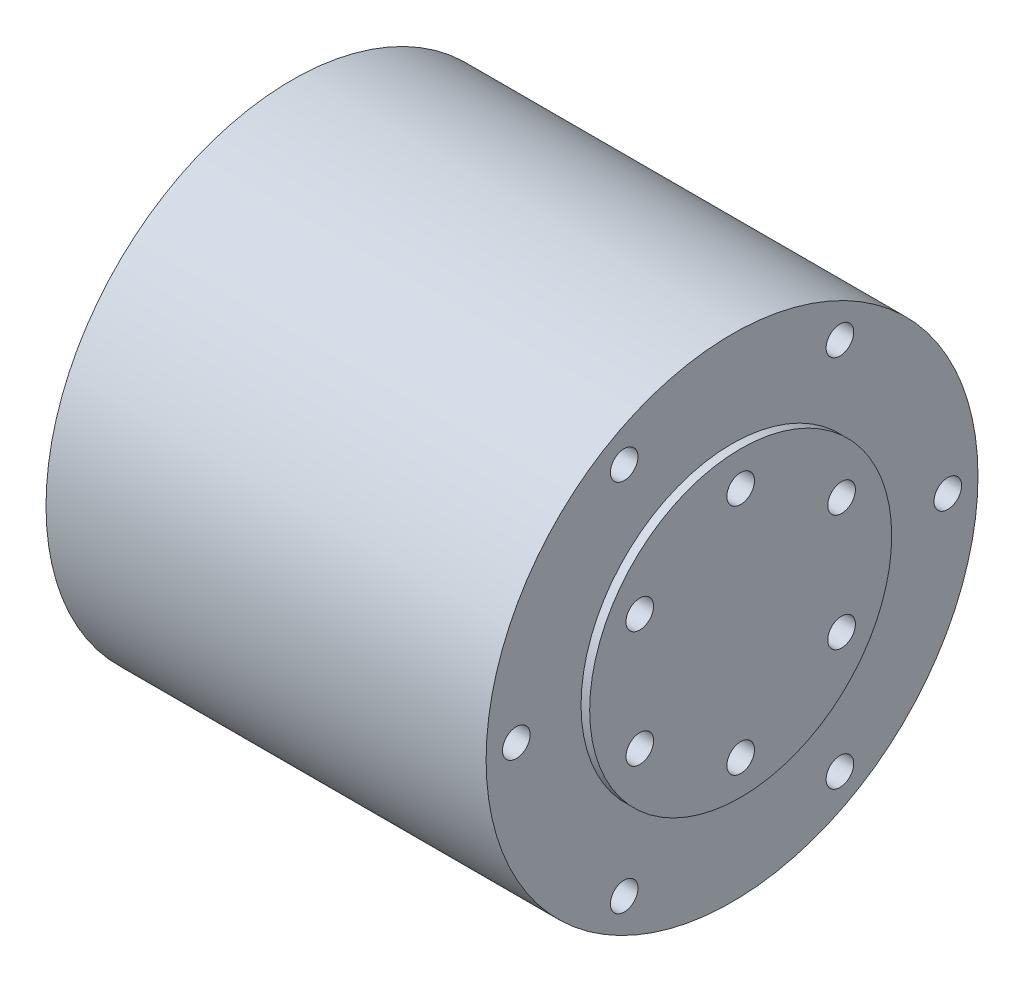
ISO-10303-21;
HEADER;
FILE_DESCRIPTION(('STEP AP214'),'2;1');
FILE_NAME('part.step','',(''),(''),'','','');
FILE_SCHEMA(('AUTOMOTIVE_DESIGN { 1 0 10303 214 1 1 1 1 }'));
ENDSEC;
DATA;
#1=APPLICATION_CONTEXT('core data for automotive mechanical design processes');
#2=APPLICATION_PROTOCOL_DEFINITION('international standard','automotive_design',2000,#1);
#3=PRODUCT_CONTEXT('',#1,'mechanical');
#4=PRODUCT('Part','Part','',(#3));
#5=PRODUCT_RELATED_PRODUCT_CATEGORY('part','',(#4));
#6=PRODUCT_DEFINITION_FORMATION('','',#4);
#7=PRODUCT_DEFINITION_CONTEXT('part definition',#1,'design');
#8=PRODUCT_DEFINITION('design','',#6,#7);
#9=PRODUCT_DEFINITION_SHAPE('','',#8);
#10=(LENGTH_UNIT() NAMED_UNIT(*) SI_UNIT(.MILLI.,.METRE.));
#11=(NAMED_UNIT(*) PLANE_ANGLE_UNIT() SI_UNIT($,.RADIAN.));
#12=(NAMED_UNIT(*) SI_UNIT($,.STERADIAN.) SOLID_ANGLE_UNIT());
#13=UNCERTAINTY_MEASURE_WITH_UNIT(LENGTH_MEASURE(1.E-05),#10,'distance_accuracy_value','');
#14=(GEOMETRIC_REPRESENTATION_CONTEXT(3) GLOBAL_UNCERTAINTY_ASSIGNED_CONTEXT((#13)) GLOBAL_UNIT_ASSIGNED_CONTEXT((#10,
#11,#12)) REPRESENTATION_CONTEXT('',''));
#15=CARTESIAN_POINT('',(0.,0.,0.));
#16=DIRECTION('',(0.,0.,1.));
#17=DIRECTION('',(1.,0.,0.));
#18=AXIS2_PLACEMENT_3D('',#15,#16,#17);
#19=CARTESIAN_POINT('',(51.,0.,0.));
#20=DIRECTION('',(-1.,0.,0.));
#21=DIRECTION('',(0.,0.,1.));
#22=AXIS2_PLACEMENT_3D('',#19,#20,#21);
#23=CYLINDRICAL_SURFACE('',#22,28.5);
#24=CARTESIAN_POINT('',(51.,0.,0.));
#25=DIRECTION('',(1.,0.,0.));
#26=DIRECTION('',(0.,0.,-1.));
#27=AXIS2_PLACEMENT_3D('',#24,#25,#26);
#28=CIRCLE('',#27,28.5);
#29=CARTESIAN_POINT('',(51.,0.,-28.5));
#30=VERTEX_POINT('',#29);
#31=EDGE_CURVE('E51',#30,#30,#28,.T.);
#32=ORIENTED_EDGE('',*,*,#31,.F.);
#33=EDGE_LOOP('',(#32));
#34=FACE_BOUND('',#33,.T.);
#35=CARTESIAN_POINT('',(0.,0.,0.));
#36=DIRECTION('',(1.,0.,0.));
#37=DIRECTION('',(0.,0.,-1.));
#38=AXIS2_PLACEMENT_3D('',#35,#36,#37);
#39=CIRCLE('',#38,28.5);
#40=CARTESIAN_POINT('',(0.,0.,-28.5));
#41=VERTEX_POINT('',#40);
#42=EDGE_CURVE('E46',#41,#41,#39,.T.);
#43=ORIENTED_EDGE('',*,*,#42,.T.);
#44=EDGE_LOOP('',(#43));
#45=FACE_BOUND('',#44,.T.);
#46=ADVANCED_FACE('F43',(#34,#45),#23,.T.);
#47=CARTESIAN_POINT('',(51.,0.,0.));
#48=DIRECTION('',(1.,0.,0.));
#49=DIRECTION('',(0.,0.,-1.));
#50=AXIS2_PLACEMENT_3D('',#47,#48,#49);
#51=PLANE('',#50);
#52=CARTESIAN_POINT('',(51.,21.6506350946109,-12.5000000000002));
#53=DIRECTION('',(1.,0.,0.));
#54=DIRECTION('',(0.,0.,-1.));
#55=AXIS2_PLACEMENT_3D('',#52,#53,#54);
#56=CIRCLE('',#55,1.6);
#57=CARTESIAN_POINT('',(51.,21.6506350946109,-14.1000000000002));
#58=VERTEX_POINT('',#57);
#59=EDGE_CURVE('E107',#58,#58,#56,.T.);
#60=ORIENTED_EDGE('',*,*,#59,.F.);
#61=EDGE_LOOP('',(#60));
#62=FACE_BOUND('',#61,.T.);
#63=CARTESIAN_POINT('',(51.,-2.68882138776405E-13,-25.));
#64=DIRECTION('',(1.,0.,0.));
#65=DIRECTION('',(0.,0.,-1.));
#66=AXIS2_PLACEMENT_3D('',#63,#64,#65);
#67=CIRCLE('',#66,1.6);
#68=CARTESIAN_POINT('',(51.,-2.68882138776405E-13,-26.6));
#69=VERTEX_POINT('',#68);
#70=EDGE_CURVE('E116',#69,#69,#67,.T.);
#71=ORIENTED_EDGE('',*,*,#70,.F.);
#72=EDGE_LOOP('',(#71));
#73=FACE_BOUND('',#72,.T.);
#74=CARTESIAN_POINT('',(51.,-21.6506350946111,-12.4999999999997));
#75=DIRECTION('',(1.,0.,0.));
#76=DIRECTION('',(0.,0.,-1.));
#77=AXIS2_PLACEMENT_3D('',#74,#75,#76);
#78=CIRCLE('',#77,1.6);
#79=CARTESIAN_POINT('',(51.,-21.6506350946111,-14.0999999999997));
#80=VERTEX_POINT('',#79);
#81=EDGE_CURVE('E124',#80,#80,#78,.T.);
#82=ORIENTED_EDGE('',*,*,#81,.F.);
#83=EDGE_LOOP('',(#82));
#84=FACE_BOUND('',#83,.T.);
#85=CARTESIAN_POINT('',(51.,-21.6506350946108,12.5000000000003));
#86=DIRECTION('',(1.,0.,0.));
#87=DIRECTION('',(0.,0.,-1.));
#88=AXIS2_PLACEMENT_3D('',#85,#86,#87);
#89=CIRCLE('',#88,1.6);
#90=CARTESIAN_POINT('',(51.,-21.6506350946108,10.9000000000003));
#91=VERTEX_POINT('',#90);
#92=EDGE_CURVE('E132',#91,#91,#89,.T.);
#93=ORIENTED_EDGE('',*,*,#92,.F.);
#94=EDGE_LOOP('',(#93));
#95=FACE_BOUND('',#94,.T.);
#96=CARTESIAN_POINT('',(51.,4.42354486374086E-13,25.));
#97=DIRECTION('',(1.,0.,0.));
#98=DIRECTION('',(0.,0.,-1.));
#99=AXIS2_PLACEMENT_3D('',#96,#97,#98);
#100=CIRCLE('',#99,1.6);
#101=CARTESIAN_POINT('',(51.,4.42354486374086E-13,23.4));
#102=VERTEX_POINT('',#101);
#103=EDGE_CURVE('E99',#102,#102,#100,.T.);
#104=ORIENTED_EDGE('',*,*,#103,.F.);
#105=EDGE_LOOP('',(#104));
#106=FACE_BOUND('',#105,.T.);
#107=CARTESIAN_POINT('',(51.,21.650635094611,12.4999999999999));
#108=DIRECTION('',(1.,0.,0.));
#109=DIRECTION('',(0.,0.,-1.));
#110=AXIS2_PLACEMENT_3D('',#107,#108,#109);
#111=CIRCLE('',#110,1.6);
#112=CARTESIAN_POINT('',(51.,21.650635094611,10.8999999999999));
#113=VERTEX_POINT('',#112);
#114=EDGE_CURVE('E95',#113,#113,#111,.T.);
#115=ORIENTED_EDGE('',*,*,#114,.F.);
#116=EDGE_LOOP('',(#115));
#117=FACE_BOUND('',#116,.T.);
#118=CARTESIAN_POINT('',(51.,0.,0.));
#119=DIRECTION('',(1.,0.,0.));
#120=DIRECTION('',(0.,0.,-1.));
#121=AXIS2_PLACEMENT_3D('',#118,#119,#120);
#122=CIRCLE('',#121,17.5);
#123=CARTESIAN_POINT('',(51.,0.,-17.5));
#124=VERTEX_POINT('',#123);
#125=EDGE_CURVE('E10',#124,#124,#122,.T.);
#126=ORIENTED_EDGE('',*,*,#125,.F.);
#127=EDGE_LOOP('',(#126));
#128=FACE_BOUND('',#127,.T.);
#129=ORIENTED_EDGE('',*,*,#31,.T.);
#130=EDGE_LOOP('',(#129));
#131=FACE_BOUND('',#130,.T.);
#132=ADVANCED_FACE('F211',(#62,#73,#84,#95,#106,#117,#128,#131),#51,.T.);
#133=CARTESIAN_POINT('',(0.,0.,0.));
#134=DIRECTION('',(1.,0.,0.));
#135=DIRECTION('',(0.,0.,-1.));
#136=AXIS2_PLACEMENT_3D('',#133,#134,#135);
#137=PLANE('',#136);
#138=CARTESIAN_POINT('',(0.,13.4350288425444,13.4350288425444));
#139=DIRECTION('',(-1.,0.,0.));
#140=DIRECTION('',(0.,0.,1.));
#141=AXIS2_PLACEMENT_3D('',#138,#139,#140);
#142=CIRCLE('',#141,1.6);
#143=CARTESIAN_POINT('',(0.,13.4350288425444,15.0350288425444));
#144=VERTEX_POINT('',#143);
#145=EDGE_CURVE('E75',#144,#144,#142,.T.);
#146=ORIENTED_EDGE('',*,*,#145,.F.);
#147=EDGE_LOOP('',(#146));
#148=FACE_BOUND('',#147,.T.);
#149=CARTESIAN_POINT('',(0.,-13.4350288425444,13.4350288425444));
#150=DIRECTION('',(-1.,0.,0.));
#151=DIRECTION('',(0.,0.,1.));
#152=AXIS2_PLACEMENT_3D('',#149,#150,#151);
#153=CIRCLE('',#152,1.6);
#154=CARTESIAN_POINT('',(0.,-13.4350288425444,15.0350288425444));
#155=VERTEX_POINT('',#154);
#156=EDGE_CURVE('E84',#155,#155,#153,.T.);
#157=ORIENTED_EDGE('',*,*,#156,.F.);
#158=EDGE_LOOP('',(#157));
#159=FACE_BOUND('',#158,.T.);
#160=CARTESIAN_POINT('',(0.,-13.4350288425443,-13.4350288425445));
#161=DIRECTION('',(-1.,0.,0.));
#162=DIRECTION('',(0.,0.,1.));
#163=AXIS2_PLACEMENT_3D('',#160,#161,#162);
#164=CIRCLE('',#163,1.6);
#165=CARTESIAN_POINT('',(0.,-13.4350288425443,-11.8350288425445));
#166=VERTEX_POINT('',#165);
#167=EDGE_CURVE('E67',#166,#166,#164,.T.);
#168=ORIENTED_EDGE('',*,*,#167,.F.);
#169=EDGE_LOOP('',(#168));
#170=FACE_BOUND('',#169,.T.);
#171=CARTESIAN_POINT('',(0.,13.4350288425445,-13.4350288425443));
#172=DIRECTION('',(-1.,0.,0.));
#173=DIRECTION('',(0.,0.,1.));
#174=AXIS2_PLACEMENT_3D('',#171,#172,#173);
#175=CIRCLE('',#174,1.6);
#176=CARTESIAN_POINT('',(0.,13.4350288425445,-11.8350288425443));
#177=VERTEX_POINT('',#176);
#178=EDGE_CURVE('E63',#177,#177,#175,.T.);
#179=ORIENTED_EDGE('',*,*,#178,.F.);
#180=EDGE_LOOP('',(#179));
#181=FACE_BOUND('',#180,.T.);
#182=ORIENTED_EDGE('',*,*,#42,.F.);
#183=EDGE_LOOP('',(#182));
#184=FACE_BOUND('',#183,.T.);
#185=ADVANCED_FACE('F205',(#148,#159,#170,#181,#184),#137,.F.);
#186=CARTESIAN_POINT('',(52.,0.,0.));
#187=DIRECTION('',(-1.,0.,0.));
#188=DIRECTION('',(0.,0.,1.));
#189=AXIS2_PLACEMENT_3D('',#186,#187,#188);
#190=CYLINDRICAL_SURFACE('',#189,17.5);
#191=CARTESIAN_POINT('',(52.,0.,0.));
#192=DIRECTION('',(1.,0.,0.));
#193=DIRECTION('',(0.,0.,-1.));
#194=AXIS2_PLACEMENT_3D('',#191,#192,#193);
#195=CIRCLE('',#194,17.5);
#196=CARTESIAN_POINT('',(52.,0.,-17.5));
#197=VERTEX_POINT('',#196);
#198=EDGE_CURVE('E58',#197,#197,#195,.T.);
#199=ORIENTED_EDGE('',*,*,#198,.F.);
#200=EDGE_LOOP('',(#199));
#201=FACE_BOUND('',#200,.T.);
#202=ORIENTED_EDGE('',*,*,#125,.T.);
#203=EDGE_LOOP('',(#202));
#204=FACE_BOUND('',#203,.T.);
#205=ADVANCED_FACE('F197',(#201,#204),#190,.T.);
#206=CARTESIAN_POINT('',(52.,0.,0.));
#207=DIRECTION('',(1.,0.,0.));
#208=DIRECTION('',(0.,0.,-1.));
#209=AXIS2_PLACEMENT_3D('',#206,#207,#208);
#210=PLANE('',#209);
#211=CARTESIAN_POINT('',(52.,13.5,0.));
#212=DIRECTION('',(1.,0.,0.));
#213=DIRECTION('',(0.,0.,-1.));
#214=AXIS2_PLACEMENT_3D('',#211,#212,#213);
#215=CIRCLE('',#214,1.6);
#216=CARTESIAN_POINT('',(52.,13.5,-1.6));
#217=VERTEX_POINT('',#216);
#218=EDGE_CURVE('E155',#217,#217,#215,.T.);
#219=ORIENTED_EDGE('',*,*,#218,.F.);
#220=EDGE_LOOP('',(#219));
#221=FACE_BOUND('',#220,.T.);
#222=CARTESIAN_POINT('',(52.,6.74999999999997,-11.6913429510899));
#223=DIRECTION('',(1.,0.,0.));
#224=DIRECTION('',(0.,0.,-1.));
#225=AXIS2_PLACEMENT_3D('',#222,#223,#224);
#226=CIRCLE('',#225,1.6);
#227=CARTESIAN_POINT('',(52.,6.74999999999997,-13.2913429510899));
#228=VERTEX_POINT('',#227);
#229=EDGE_CURVE('E163',#228,#228,#226,.T.);
#230=ORIENTED_EDGE('',*,*,#229,.F.);
#231=EDGE_LOOP('',(#230));
#232=FACE_BOUND('',#231,.T.);
#233=CARTESIAN_POINT('',(52.,-6.75000000000005,-11.6913429510899));
#234=DIRECTION('',(1.,0.,0.));
#235=DIRECTION('',(0.,0.,-1.));
#236=AXIS2_PLACEMENT_3D('',#233,#234,#235);
#237=CIRCLE('',#236,1.6);
#238=CARTESIAN_POINT('',(52.,-6.75000000000005,-13.2913429510899));
#239=VERTEX_POINT('',#238);
#240=EDGE_CURVE('E171',#239,#239,#237,.T.);
#241=ORIENTED_EDGE('',*,*,#240,.F.);
#242=EDGE_LOOP('',(#241));
#243=FACE_BOUND('',#242,.T.);
#244=CARTESIAN_POINT('',(52.,-13.5,0.));
#245=DIRECTION('',(1.,0.,0.));
#246=DIRECTION('',(0.,0.,-1.));
#247=AXIS2_PLACEMENT_3D('',#244,#245,#246);
#248=CIRCLE('',#247,1.6);
#249=CARTESIAN_POINT('',(52.,-13.5,-1.59999999999991));
#250=VERTEX_POINT('',#249);
#251=EDGE_CURVE('E179',#250,#250,#248,.T.);
#252=ORIENTED_EDGE('',*,*,#251,.F.);
#253=EDGE_LOOP('',(#252));
#254=FACE_BOUND('',#253,.T.);
#255=CARTESIAN_POINT('',(52.,-6.74999999999989,11.69134295109));
#256=DIRECTION('',(1.,0.,0.));
#257=DIRECTION('',(0.,0.,-1.));
#258=AXIS2_PLACEMENT_3D('',#255,#256,#257);
#259=CIRCLE('',#258,1.6);
#260=CARTESIAN_POINT('',(52.,-6.74999999999989,10.09134295109));
#261=VERTEX_POINT('',#260);
#262=EDGE_CURVE('E147',#261,#261,#259,.T.);
#263=ORIENTED_EDGE('',*,*,#262,.F.);
#264=EDGE_LOOP('',(#263));
#265=FACE_BOUND('',#264,.T.);
#266=CARTESIAN_POINT('',(52.,6.75000000000014,11.6913429510898));
#267=DIRECTION('',(1.,0.,0.));
#268=DIRECTION('',(0.,0.,-1.));
#269=AXIS2_PLACEMENT_3D('',#266,#267,#268);
#270=CIRCLE('',#269,1.6);
#271=CARTESIAN_POINT('',(52.,6.75000000000014,10.0913429510898));
#272=VERTEX_POINT('',#271);
#273=EDGE_CURVE('E143',#272,#272,#270,.T.);
#274=ORIENTED_EDGE('',*,*,#273,.F.);
#275=EDGE_LOOP('',(#274));
#276=FACE_BOUND('',#275,.T.);
#277=ORIENTED_EDGE('',*,*,#198,.T.);
#278=EDGE_LOOP('',(#277));
#279=FACE_BOUND('',#278,.T.);
#280=ADVANCED_FACE('F193',(#221,#232,#243,#254,#265,#276,#279),#210,.T.);
#281=CARTESIAN_POINT('',(5.,13.4350288425445,-13.4350288425443));
#282=DIRECTION('',(-1.,0.,0.));
#283=DIRECTION('',(0.,0.,1.));
#284=AXIS2_PLACEMENT_3D('',#281,#282,#283);
#285=CYLINDRICAL_SURFACE('',#284,1.6);
#286=CARTESIAN_POINT('',(5.,13.4350288425445,-13.4350288425443));
#287=DIRECTION('',(-1.,0.,0.));
#288=DIRECTION('',(0.,0.,1.));
#289=AXIS2_PLACEMENT_3D('',#286,#287,#288);
#290=CIRCLE('',#289,1.6);
#291=CARTESIAN_POINT('',(5.,13.4350288425445,-11.8350288425443));
#292=VERTEX_POINT('',#291);
#293=EDGE_CURVE('E62',#292,#292,#290,.T.);
#294=ORIENTED_EDGE('',*,*,#293,.F.);
#295=EDGE_LOOP('',(#294));
#296=FACE_BOUND('',#295,.T.);
#297=ORIENTED_EDGE('',*,*,#178,.T.);
#298=EDGE_LOOP('',(#297));
#299=FACE_BOUND('',#298,.T.);
#300=ADVANCED_FACE('F196',(#296,#299),#285,.F.);
#301=CARTESIAN_POINT('',(5.,13.4350288425445,-13.4350288425443));
#302=DIRECTION('',(-1.,0.,0.));
#303=DIRECTION('',(0.,0.,1.));
#304=AXIS2_PLACEMENT_3D('',#301,#302,#303);
#305=PLANE('',#304);
#306=ORIENTED_EDGE('',*,*,#293,.T.);
#307=EDGE_LOOP('',(#306));
#308=FACE_BOUND('',#307,.T.);
#309=ADVANCED_FACE('F264',(#308),#305,.T.);
#310=CARTESIAN_POINT('',(5.,-13.4350288425443,-13.4350288425445));
#311=DIRECTION('',(-1.,0.,0.));
#312=DIRECTION('',(0.,0.,1.));
#313=AXIS2_PLACEMENT_3D('',#310,#311,#312);
#314=CYLINDRICAL_SURFACE('',#313,1.6);
#315=CARTESIAN_POINT('',(5.,-13.4350288425443,-13.4350288425445));
#316=DIRECTION('',(-1.,0.,0.));
#317=DIRECTION('',(0.,0.,1.));
#318=AXIS2_PLACEMENT_3D('',#315,#316,#317);
#319=CIRCLE('',#318,1.6);
#320=CARTESIAN_POINT('',(5.,-13.4350288425443,-11.8350288425445));
#321=VERTEX_POINT('',#320);
#322=EDGE_CURVE('E88',#321,#321,#319,.T.);
#323=ORIENTED_EDGE('',*,*,#322,.F.);
#324=EDGE_LOOP('',(#323));
#325=FACE_BOUND('',#324,.T.);
#326=ORIENTED_EDGE('',*,*,#167,.T.);
#327=EDGE_LOOP('',(#326));
#328=FACE_BOUND('',#327,.T.);
#329=ADVANCED_FACE('F260',(#325,#328),#314,.F.);
#330=CARTESIAN_POINT('',(5.,-13.4350288425443,-13.4350288425445));
#331=DIRECTION('',(-1.,0.,0.));
#332=DIRECTION('',(0.,0.,1.));
#333=AXIS2_PLACEMENT_3D('',#330,#331,#332);
#334=PLANE('',#333);
#335=ORIENTED_EDGE('',*,*,#322,.T.);
#336=EDGE_LOOP('',(#335));
#337=FACE_BOUND('',#336,.T.);
#338=ADVANCED_FACE('F263',(#337),#334,.T.);
#339=CARTESIAN_POINT('',(5.,-13.4350288425444,13.4350288425444));
#340=DIRECTION('',(-1.,0.,0.));
#341=DIRECTION('',(0.,0.,1.));
#342=AXIS2_PLACEMENT_3D('',#339,#340,#341);
#343=CYLINDRICAL_SURFACE('',#342,1.6);
#344=CARTESIAN_POINT('',(5.,-13.4350288425444,13.4350288425444));
#345=DIRECTION('',(-1.,0.,0.));
#346=DIRECTION('',(0.,0.,1.));
#347=AXIS2_PLACEMENT_3D('',#344,#345,#346);
#348=CIRCLE('',#347,1.6);
#349=CARTESIAN_POINT('',(5.,-13.4350288425444,15.0350288425444));
#350=VERTEX_POINT('',#349);
#351=EDGE_CURVE('E80',#350,#350,#348,.T.);
#352=ORIENTED_EDGE('',*,*,#351,.F.);
#353=EDGE_LOOP('',(#352));
#354=FACE_BOUND('',#353,.T.);
#355=ORIENTED_EDGE('',*,*,#156,.T.);
#356=EDGE_LOOP('',(#355));
#357=FACE_BOUND('',#356,.T.);
#358=ADVANCED_FACE('F268',(#354,#357),#343,.F.);
#359=CARTESIAN_POINT('',(5.,-13.4350288425444,13.4350288425444));
#360=DIRECTION('',(-1.,0.,0.));
#361=DIRECTION('',(0.,0.,1.));
#362=AXIS2_PLACEMENT_3D('',#359,#360,#361);
#363=PLANE('',#362);
#364=ORIENTED_EDGE('',*,*,#351,.T.);
#365=EDGE_LOOP('',(#364));
#366=FACE_BOUND('',#365,.T.);
#367=ADVANCED_FACE('F272',(#366),#363,.T.);
#368=CARTESIAN_POINT('',(5.,13.4350288425444,13.4350288425444));
#369=DIRECTION('',(-1.,0.,0.));
#370=DIRECTION('',(0.,0.,1.));
#371=AXIS2_PLACEMENT_3D('',#368,#369,#370);
#372=CYLINDRICAL_SURFACE('',#371,1.6);
#373=CARTESIAN_POINT('',(5.,13.4350288425444,13.4350288425444));
#374=DIRECTION('',(-1.,0.,0.));
#375=DIRECTION('',(0.,0.,1.));
#376=AXIS2_PLACEMENT_3D('',#373,#374,#375);
#377=CIRCLE('',#376,1.6);
#378=CARTESIAN_POINT('',(5.,13.4350288425444,15.0350288425444));
#379=VERTEX_POINT('',#378);
#380=EDGE_CURVE('E71',#379,#379,#377,.T.);
#381=ORIENTED_EDGE('',*,*,#380,.F.);
#382=EDGE_LOOP('',(#381));
#383=FACE_BOUND('',#382,.T.);
#384=ORIENTED_EDGE('',*,*,#145,.T.);
#385=EDGE_LOOP('',(#384));
#386=FACE_BOUND('',#385,.T.);
#387=ADVANCED_FACE('F254',(#383,#386),#372,.F.);
#388=CARTESIAN_POINT('',(5.,13.4350288425444,13.4350288425444));
#389=DIRECTION('',(-1.,0.,0.));
#390=DIRECTION('',(0.,0.,1.));
#391=AXIS2_PLACEMENT_3D('',#388,#389,#390);
#392=PLANE('',#391);
#393=ORIENTED_EDGE('',*,*,#380,.T.);
#394=EDGE_LOOP('',(#393));
#395=FACE_BOUND('',#394,.T.);
#396=ADVANCED_FACE('F245',(#395),#392,.T.);
#397=CARTESIAN_POINT('',(46.,21.650635094611,12.4999999999999));
#398=DIRECTION('',(1.,0.,0.));
#399=DIRECTION('',(0.,0.,-1.));
#400=AXIS2_PLACEMENT_3D('',#397,#398,#399);
#401=CYLINDRICAL_SURFACE('',#400,1.6);
#402=CARTESIAN_POINT('',(46.,21.650635094611,12.4999999999999));
#403=DIRECTION('',(1.,0.,0.));
#404=DIRECTION('',(0.,0.,-1.));
#405=AXIS2_PLACEMENT_3D('',#402,#403,#404);
#406=CIRCLE('',#405,1.6);
#407=CARTESIAN_POINT('',(46.,21.650635094611,10.8999999999999));
#408=VERTEX_POINT('',#407);
#409=EDGE_CURVE('E76',#408,#408,#406,.T.);
#410=ORIENTED_EDGE('',*,*,#409,.F.);
#411=EDGE_LOOP('',(#410));
#412=FACE_BOUND('',#411,.T.);
#413=ORIENTED_EDGE('',*,*,#114,.T.);
#414=EDGE_LOOP('',(#413));
#415=FACE_BOUND('',#414,.T.);
#416=ADVANCED_FACE('F243',(#412,#415),#401,.F.);
#417=CARTESIAN_POINT('',(46.,21.650635094611,12.4999999999999));
#418=DIRECTION('',(1.,0.,0.));
#419=DIRECTION('',(0.,0.,-1.));
#420=AXIS2_PLACEMENT_3D('',#417,#418,#419);
#421=PLANE('',#420);
#422=ORIENTED_EDGE('',*,*,#409,.T.);
#423=EDGE_LOOP('',(#422));
#424=FACE_BOUND('',#423,.T.);
#425=ADVANCED_FACE('F244',(#424),#421,.T.);
#426=CARTESIAN_POINT('',(46.,4.42354486374086E-13,25.));
#427=DIRECTION('',(1.,0.,0.));
#428=DIRECTION('',(0.,0.,-1.));
#429=AXIS2_PLACEMENT_3D('',#426,#427,#428);
#430=CYLINDRICAL_SURFACE('',#429,1.6);
#431=CARTESIAN_POINT('',(46.,4.42354486374086E-13,25.));
#432=DIRECTION('',(1.,0.,0.));
#433=DIRECTION('',(0.,0.,-1.));
#434=AXIS2_PLACEMENT_3D('',#431,#432,#433);
#435=CIRCLE('',#434,1.6);
#436=CARTESIAN_POINT('',(46.,4.42354486374086E-13,23.4));
#437=VERTEX_POINT('',#436);
#438=EDGE_CURVE('E136',#437,#437,#435,.T.);
#439=ORIENTED_EDGE('',*,*,#438,.F.);
#440=EDGE_LOOP('',(#439));
#441=FACE_BOUND('',#440,.T.);
#442=ORIENTED_EDGE('',*,*,#103,.T.);
#443=EDGE_LOOP('',(#442));
#444=FACE_BOUND('',#443,.T.);
#445=ADVANCED_FACE('F251',(#441,#444),#430,.F.);
#446=CARTESIAN_POINT('',(46.,4.42354486374086E-13,25.));
#447=DIRECTION('',(1.,0.,0.));
#448=DIRECTION('',(0.,0.,-1.));
#449=AXIS2_PLACEMENT_3D('',#446,#447,#448);
#450=PLANE('',#449);
#451=ORIENTED_EDGE('',*,*,#438,.T.);
#452=EDGE_LOOP('',(#451));
#453=FACE_BOUND('',#452,.T.);
#454=ADVANCED_FACE('F349',(#453),#450,.T.);
#455=CARTESIAN_POINT('',(46.,-21.6506350946108,12.5000000000003));
#456=DIRECTION('',(1.,0.,0.));
#457=DIRECTION('',(0.,0.,-1.));
#458=AXIS2_PLACEMENT_3D('',#455,#456,#457);
#459=CYLINDRICAL_SURFACE('',#458,1.6);
#460=CARTESIAN_POINT('',(46.,-21.6506350946108,12.5000000000003));
#461=DIRECTION('',(1.,0.,0.));
#462=DIRECTION('',(0.,0.,-1.));
#463=AXIS2_PLACEMENT_3D('',#460,#461,#462);
#464=CIRCLE('',#463,1.6);
#465=CARTESIAN_POINT('',(46.,-21.6506350946108,10.9000000000003));
#466=VERTEX_POINT('',#465);
#467=EDGE_CURVE('E128',#466,#466,#464,.T.);
#468=ORIENTED_EDGE('',*,*,#467,.F.);
#469=EDGE_LOOP('',(#468));
#470=FACE_BOUND('',#469,.T.);
#471=ORIENTED_EDGE('',*,*,#92,.T.);
#472=EDGE_LOOP('',(#471));
#473=FACE_BOUND('',#472,.T.);
#474=ADVANCED_FACE('F359',(#470,#473),#459,.F.);
#475=CARTESIAN_POINT('',(46.,-21.6506350946108,12.5000000000003));
#476=DIRECTION('',(1.,0.,0.));
#477=DIRECTION('',(0.,0.,-1.));
#478=AXIS2_PLACEMENT_3D('',#475,#476,#477);
#479=PLANE('',#478);
#480=ORIENTED_EDGE('',*,*,#467,.T.);
#481=EDGE_LOOP('',(#480));
#482=FACE_BOUND('',#481,.T.);
#483=ADVANCED_FACE('F369',(#482),#479,.T.);
#484=CARTESIAN_POINT('',(46.,-21.6506350946111,-12.4999999999997));
#485=DIRECTION('',(1.,0.,0.));
#486=DIRECTION('',(0.,0.,-1.));
#487=AXIS2_PLACEMENT_3D('',#484,#485,#486);
#488=CYLINDRICAL_SURFACE('',#487,1.6);
#489=CARTESIAN_POINT('',(46.,-21.6506350946111,-12.4999999999997));
#490=DIRECTION('',(1.,0.,0.));
#491=DIRECTION('',(0.,0.,-1.));
#492=AXIS2_PLACEMENT_3D('',#489,#490,#491);
#493=CIRCLE('',#492,1.6);
#494=CARTESIAN_POINT('',(46.,-21.6506350946111,-14.0999999999997));
#495=VERTEX_POINT('',#494);
#496=EDGE_CURVE('E120',#495,#495,#493,.T.);
#497=ORIENTED_EDGE('',*,*,#496,.F.);
#498=EDGE_LOOP('',(#497));
#499=FACE_BOUND('',#498,.T.);
#500=ORIENTED_EDGE('',*,*,#81,.T.);
#501=EDGE_LOOP('',(#500));
#502=FACE_BOUND('',#501,.T.);
#503=ADVANCED_FACE('F379',(#499,#502),#488,.F.);
#504=CARTESIAN_POINT('',(46.,-21.6506350946111,-12.4999999999997));
#505=DIRECTION('',(1.,0.,0.));
#506=DIRECTION('',(0.,0.,-1.));
#507=AXIS2_PLACEMENT_3D('',#504,#505,#506);
#508=PLANE('',#507);
#509=ORIENTED_EDGE('',*,*,#496,.T.);
#510=EDGE_LOOP('',(#509));
#511=FACE_BOUND('',#510,.T.);
#512=ADVANCED_FACE('F389',(#511),#508,.T.);
#513=CARTESIAN_POINT('',(46.,-2.68882138776405E-13,-25.));
#514=DIRECTION('',(1.,0.,0.));
#515=DIRECTION('',(0.,0.,-1.));
#516=AXIS2_PLACEMENT_3D('',#513,#514,#515);
#517=CYLINDRICAL_SURFACE('',#516,1.6);
#518=CARTESIAN_POINT('',(46.,-2.68882138776405E-13,-25.));
#519=DIRECTION('',(1.,0.,0.));
#520=DIRECTION('',(0.,0.,-1.));
#521=AXIS2_PLACEMENT_3D('',#518,#519,#520);
#522=CIRCLE('',#521,1.6);
#523=CARTESIAN_POINT('',(46.,-2.68882138776405E-13,-26.6));
#524=VERTEX_POINT('',#523);
#525=EDGE_CURVE('E112',#524,#524,#522,.T.);
#526=ORIENTED_EDGE('',*,*,#525,.F.);
#527=EDGE_LOOP('',(#526));
#528=FACE_BOUND('',#527,.T.);
#529=ORIENTED_EDGE('',*,*,#70,.T.);
#530=EDGE_LOOP('',(#529));
#531=FACE_BOUND('',#530,.T.);
#532=ADVANCED_FACE('F399',(#528,#531),#517,.F.);
#533=CARTESIAN_POINT('',(46.,-2.68882138776405E-13,-25.));
#534=DIRECTION('',(1.,0.,0.));
#535=DIRECTION('',(0.,0.,-1.));
#536=AXIS2_PLACEMENT_3D('',#533,#534,#535);
#537=PLANE('',#536);
#538=ORIENTED_EDGE('',*,*,#525,.T.);
#539=EDGE_LOOP('',(#538));
#540=FACE_BOUND('',#539,.T.);
#541=ADVANCED_FACE('F409',(#540),#537,.T.);
#542=CARTESIAN_POINT('',(46.,21.6506350946109,-12.5000000000002));
#543=DIRECTION('',(1.,0.,0.));
#544=DIRECTION('',(0.,0.,-1.));
#545=AXIS2_PLACEMENT_3D('',#542,#543,#544);
#546=CYLINDRICAL_SURFACE('',#545,1.6);
#547=CARTESIAN_POINT('',(46.,21.6506350946109,-12.5000000000002));
#548=DIRECTION('',(1.,0.,0.));
#549=DIRECTION('',(0.,0.,-1.));
#550=AXIS2_PLACEMENT_3D('',#547,#548,#549);
#551=CIRCLE('',#550,1.6);
#552=CARTESIAN_POINT('',(46.,21.6506350946109,-14.1000000000002));
#553=VERTEX_POINT('',#552);
#554=EDGE_CURVE('E103',#553,#553,#551,.T.);
#555=ORIENTED_EDGE('',*,*,#554,.F.);
#556=EDGE_LOOP('',(#555));
#557=FACE_BOUND('',#556,.T.);
#558=ORIENTED_EDGE('',*,*,#59,.T.);
#559=EDGE_LOOP('',(#558));
#560=FACE_BOUND('',#559,.T.);
#561=ADVANCED_FACE('F419',(#557,#560),#546,.F.);
#562=CARTESIAN_POINT('',(46.,21.6506350946109,-12.5000000000002));
#563=DIRECTION('',(1.,0.,0.));
#564=DIRECTION('',(0.,0.,-1.));
#565=AXIS2_PLACEMENT_3D('',#562,#563,#564);
#566=PLANE('',#565);
#567=ORIENTED_EDGE('',*,*,#554,.T.);
#568=EDGE_LOOP('',(#567));
#569=FACE_BOUND('',#568,.T.);
#570=ADVANCED_FACE('F429',(#569),#566,.T.);
#571=CARTESIAN_POINT('',(47.,6.75000000000014,11.6913429510898));
#572=DIRECTION('',(1.,0.,0.));
#573=DIRECTION('',(0.,0.,-1.));
#574=AXIS2_PLACEMENT_3D('',#571,#572,#573);
#575=CYLINDRICAL_SURFACE('',#574,1.6);
#576=CARTESIAN_POINT('',(47.,6.75000000000014,11.6913429510898));
#577=DIRECTION('',(1.,0.,0.));
#578=DIRECTION('',(0.,0.,-1.));
#579=AXIS2_PLACEMENT_3D('',#576,#577,#578);
#580=CIRCLE('',#579,1.6);
#581=CARTESIAN_POINT('',(47.,6.75000000000014,10.0913429510898));
#582=VERTEX_POINT('',#581);
#583=EDGE_CURVE('E108',#582,#582,#580,.T.);
#584=ORIENTED_EDGE('',*,*,#583,.F.);
#585=EDGE_LOOP('',(#584));
#586=FACE_BOUND('',#585,.T.);
#587=ORIENTED_EDGE('',*,*,#273,.T.);
#588=EDGE_LOOP('',(#587));
#589=FACE_BOUND('',#588,.T.);
#590=ADVANCED_FACE('F439',(#586,#589),#575,.F.);
#591=CARTESIAN_POINT('',(47.,6.75000000000014,11.6913429510898));
#592=DIRECTION('',(1.,0.,0.));
#593=DIRECTION('',(0.,0.,-1.));
#594=AXIS2_PLACEMENT_3D('',#591,#592,#593);
#595=PLANE('',#594);
#596=ORIENTED_EDGE('',*,*,#583,.T.);
#597=EDGE_LOOP('',(#596));
#598=FACE_BOUND('',#597,.T.);
#599=ADVANCED_FACE('F448',(#598),#595,.T.);
#600=CARTESIAN_POINT('',(47.,-6.74999999999989,11.69134295109));
#601=DIRECTION('',(1.,0.,0.));
#602=DIRECTION('',(0.,0.,-1.));
#603=AXIS2_PLACEMENT_3D('',#600,#601,#602);
#604=CYLINDRICAL_SURFACE('',#603,1.6);
#605=CARTESIAN_POINT('',(47.,-6.74999999999989,11.69134295109));
#606=DIRECTION('',(1.,0.,0.));
#607=DIRECTION('',(0.,0.,-1.));
#608=AXIS2_PLACEMENT_3D('',#605,#606,#607);
#609=CIRCLE('',#608,1.6);
#610=CARTESIAN_POINT('',(47.,-6.74999999999989,10.09134295109));
#611=VERTEX_POINT('',#610);
#612=EDGE_CURVE('E183',#611,#611,#609,.T.);
#613=ORIENTED_EDGE('',*,*,#612,.F.);
#614=EDGE_LOOP('',(#613));
#615=FACE_BOUND('',#614,.T.);
#616=ORIENTED_EDGE('',*,*,#262,.T.);
#617=EDGE_LOOP('',(#616));
#618=FACE_BOUND('',#617,.T.);
#619=ADVANCED_FACE('F191',(#615,#618),#604,.F.);
#620=CARTESIAN_POINT('',(47.,-6.74999999999989,11.69134295109));
#621=DIRECTION('',(1.,0.,0.));
#622=DIRECTION('',(0.,0.,-1.));
#623=AXIS2_PLACEMENT_3D('',#620,#621,#622);
#624=PLANE('',#623);
#625=ORIENTED_EDGE('',*,*,#612,.T.);
#626=EDGE_LOOP('',(#625));
#627=FACE_BOUND('',#626,.T.);
#628=ADVANCED_FACE('F467',(#627),#624,.T.);
#629=CARTESIAN_POINT('',(47.,-13.5,0.));
#630=DIRECTION('',(1.,0.,0.));
#631=DIRECTION('',(0.,0.,-1.));
#632=AXIS2_PLACEMENT_3D('',#629,#630,#631);
#633=CYLINDRICAL_SURFACE('',#632,1.6);
#634=CARTESIAN_POINT('',(47.,-13.5,0.));
#635=DIRECTION('',(1.,0.,0.));
#636=DIRECTION('',(0.,0.,-1.));
#637=AXIS2_PLACEMENT_3D('',#634,#635,#636);
#638=CIRCLE('',#637,1.6);
#639=CARTESIAN_POINT('',(47.,-13.5,-1.59999999999991));
#640=VERTEX_POINT('',#639);
#641=EDGE_CURVE('E175',#640,#640,#638,.T.);
#642=ORIENTED_EDGE('',*,*,#641,.F.);
#643=EDGE_LOOP('',(#642));
#644=FACE_BOUND('',#643,.T.);
#645=ORIENTED_EDGE('',*,*,#251,.T.);
#646=EDGE_LOOP('',(#645));
#647=FACE_BOUND('',#646,.T.);
#648=ADVANCED_FACE('F477',(#644,#647),#633,.F.);
#649=CARTESIAN_POINT('',(47.,-13.5,0.));
#650=DIRECTION('',(1.,0.,0.));
#651=DIRECTION('',(0.,0.,-1.));
#652=AXIS2_PLACEMENT_3D('',#649,#650,#651);
#653=PLANE('',#652);
#654=ORIENTED_EDGE('',*,*,#641,.T.);
#655=EDGE_LOOP('',(#654));
#656=FACE_BOUND('',#655,.T.);
#657=ADVANCED_FACE('F487',(#656),#653,.T.);
#658=CARTESIAN_POINT('',(47.,-6.75000000000005,-11.6913429510899));
#659=DIRECTION('',(1.,0.,0.));
#660=DIRECTION('',(0.,0.,-1.));
#661=AXIS2_PLACEMENT_3D('',#658,#659,#660);
#662=CYLINDRICAL_SURFACE('',#661,1.6);
#663=CARTESIAN_POINT('',(47.,-6.75000000000005,-11.6913429510899));
#664=DIRECTION('',(1.,0.,0.));
#665=DIRECTION('',(0.,0.,-1.));
#666=AXIS2_PLACEMENT_3D('',#663,#664,#665);
#667=CIRCLE('',#666,1.6);
#668=CARTESIAN_POINT('',(47.,-6.75000000000005,-13.2913429510899));
#669=VERTEX_POINT('',#668);
#670=EDGE_CURVE('E167',#669,#669,#667,.T.);
#671=ORIENTED_EDGE('',*,*,#670,.F.);
#672=EDGE_LOOP('',(#671));
#673=FACE_BOUND('',#672,.T.);
#674=ORIENTED_EDGE('',*,*,#240,.T.);
#675=EDGE_LOOP('',(#674));
#676=FACE_BOUND('',#675,.T.);
#677=ADVANCED_FACE('F497',(#673,#676),#662,.F.);
#678=CARTESIAN_POINT('',(47.,-6.75000000000005,-11.6913429510899));
#679=DIRECTION('',(1.,0.,0.));
#680=DIRECTION('',(0.,0.,-1.));
#681=AXIS2_PLACEMENT_3D('',#678,#679,#680);
#682=PLANE('',#681);
#683=ORIENTED_EDGE('',*,*,#670,.T.);
#684=EDGE_LOOP('',(#683));
#685=FACE_BOUND('',#684,.T.);
#686=ADVANCED_FACE('F507',(#685),#682,.T.);
#687=CARTESIAN_POINT('',(47.,6.74999999999997,-11.6913429510899));
#688=DIRECTION('',(1.,0.,0.));
#689=DIRECTION('',(0.,0.,-1.));
#690=AXIS2_PLACEMENT_3D('',#687,#688,#689);
#691=CYLINDRICAL_SURFACE('',#690,1.6);
#692=CARTESIAN_POINT('',(47.,6.74999999999997,-11.6913429510899));
#693=DIRECTION('',(1.,0.,0.));
#694=DIRECTION('',(0.,0.,-1.));
#695=AXIS2_PLACEMENT_3D('',#692,#693,#694);
#696=CIRCLE('',#695,1.6);
#697=CARTESIAN_POINT('',(47.,6.74999999999997,-13.2913429510899));
#698=VERTEX_POINT('',#697);
#699=EDGE_CURVE('E159',#698,#698,#696,.T.);
#700=ORIENTED_EDGE('',*,*,#699,.F.);
#701=EDGE_LOOP('',(#700));
#702=FACE_BOUND('',#701,.T.);
#703=ORIENTED_EDGE('',*,*,#229,.T.);
#704=EDGE_LOOP('',(#703));
#705=FACE_BOUND('',#704,.T.);
#706=ADVANCED_FACE('F517',(#702,#705),#691,.F.);
#707=CARTESIAN_POINT('',(47.,6.74999999999997,-11.6913429510899));
#708=DIRECTION('',(1.,0.,0.));
#709=DIRECTION('',(0.,0.,-1.));
#710=AXIS2_PLACEMENT_3D('',#707,#708,#709);
#711=PLANE('',#710);
#712=ORIENTED_EDGE('',*,*,#699,.T.);
#713=EDGE_LOOP('',(#712));
#714=FACE_BOUND('',#713,.T.);
#715=ADVANCED_FACE('F527',(#714),#711,.T.);
#716=CARTESIAN_POINT('',(47.,13.5,0.));
#717=DIRECTION('',(1.,0.,0.));
#718=DIRECTION('',(0.,0.,-1.));
#719=AXIS2_PLACEMENT_3D('',#716,#717,#718);
#720=CYLINDRICAL_SURFACE('',#719,1.6);
#721=CARTESIAN_POINT('',(47.,13.5,0.));
#722=DIRECTION('',(1.,0.,0.));
#723=DIRECTION('',(0.,0.,-1.));
#724=AXIS2_PLACEMENT_3D('',#721,#722,#723);
#725=CIRCLE('',#724,1.6);
#726=CARTESIAN_POINT('',(47.,13.5,-1.6));
#727=VERTEX_POINT('',#726);
#728=EDGE_CURVE('E151',#727,#727,#725,.T.);
#729=ORIENTED_EDGE('',*,*,#728,.F.);
#730=EDGE_LOOP('',(#729));
#731=FACE_BOUND('',#730,.T.);
#732=ORIENTED_EDGE('',*,*,#218,.T.);
#733=EDGE_LOOP('',(#732));
#734=FACE_BOUND('',#733,.T.);
#735=ADVANCED_FACE('F537',(#731,#734),#720,.F.);
#736=CARTESIAN_POINT('',(47.,13.5,0.));
#737=DIRECTION('',(1.,0.,0.));
#738=DIRECTION('',(0.,0.,-1.));
#739=AXIS2_PLACEMENT_3D('',#736,#737,#738);
#740=PLANE('',#739);
#741=ORIENTED_EDGE('',*,*,#728,.T.);
#742=EDGE_LOOP('',(#741));
#743=FACE_BOUND('',#742,.T.);
#744=ADVANCED_FACE('F547',(#743),#740,.T.);
#745=CLOSED_SHELL('',(#46,#132,#185,#205,#280,#300,#309,#329,#338,#358,#367,#387,#396,#416,#425,
#445,#454,#474,#483,#503,#512,#532,#541,#561,#570,#590,#599,#619,#628,#648,#657,#677,#686,#706,
#715,#735,#744));
#746=MANIFOLD_SOLID_BREP('B2',#745);
#747=ADVANCED_BREP_SHAPE_REPRESENTATION('',(#18,#746),#14);
#748=SHAPE_DEFINITION_REPRESENTATION(#9,#747);
ENDSEC;
END-ISO-10303-21;
